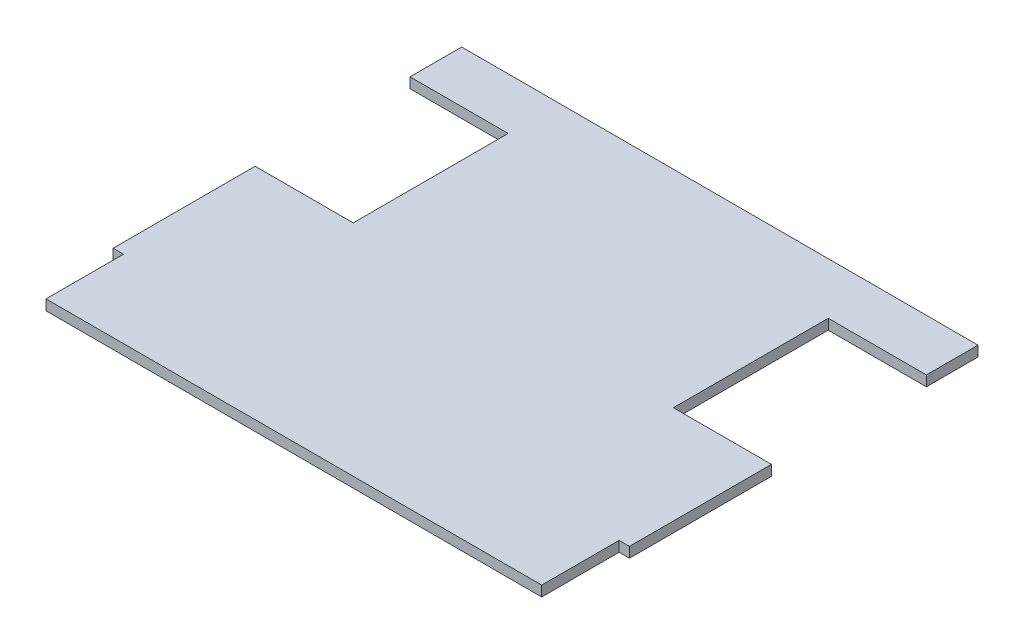
ISO-10303-21;
HEADER;
FILE_DESCRIPTION(('STEP AP214'),'2;1');
FILE_NAME('part.step','',(''),(''),'','','');
FILE_SCHEMA(('AUTOMOTIVE_DESIGN { 1 0 10303 214 1 1 1 1 }'));
ENDSEC;
DATA;
#1=APPLICATION_CONTEXT('core data for automotive mechanical design processes');
#2=APPLICATION_PROTOCOL_DEFINITION('international standard','automotive_design',2000,#1);
#3=PRODUCT_CONTEXT('',#1,'mechanical');
#4=PRODUCT('Part','Part','',(#3));
#5=PRODUCT_RELATED_PRODUCT_CATEGORY('part','',(#4));
#6=PRODUCT_DEFINITION_FORMATION('','',#4);
#7=PRODUCT_DEFINITION_CONTEXT('part definition',#1,'design');
#8=PRODUCT_DEFINITION('design','',#6,#7);
#9=PRODUCT_DEFINITION_SHAPE('','',#8);
#10=(LENGTH_UNIT() NAMED_UNIT(*) SI_UNIT(.MILLI.,.METRE.));
#11=(NAMED_UNIT(*) PLANE_ANGLE_UNIT() SI_UNIT($,.RADIAN.));
#12=(NAMED_UNIT(*) SI_UNIT($,.STERADIAN.) SOLID_ANGLE_UNIT());
#13=UNCERTAINTY_MEASURE_WITH_UNIT(LENGTH_MEASURE(1.E-05),#10,'distance_accuracy_value','');
#14=(GEOMETRIC_REPRESENTATION_CONTEXT(3) GLOBAL_UNCERTAINTY_ASSIGNED_CONTEXT((#13)) GLOBAL_UNIT_ASSIGNED_CONTEXT((#10,
#11,#12)) REPRESENTATION_CONTEXT('',''));
#15=CARTESIAN_POINT('',(0.,0.,0.));
#16=DIRECTION('',(0.,0.,1.));
#17=DIRECTION('',(1.,0.,0.));
#18=AXIS2_PLACEMENT_3D('',#15,#16,#17);
#19=CARTESIAN_POINT('',(100.,4.,0.));
#20=DIRECTION('',(1.,0.,0.));
#21=DIRECTION('',(0.,0.,-1.));
#22=AXIS2_PLACEMENT_3D('',#19,#20,#21);
#23=PLANE('',#22);
#24=DIRECTION('',(0.,1.,0.));
#25=VECTOR('',#24,1.);
#26=CARTESIAN_POINT('',(100.,-0.00100000000000013,52.5));
#27=LINE('',#26,#25);
#28=CARTESIAN_POINT('',(100.,0.,52.5));
#29=VERTEX_POINT('',#28);
#30=CARTESIAN_POINT('',(100.,4.,52.5));
#31=VERTEX_POINT('',#30);
#32=EDGE_CURVE('E157',#29,#31,#27,.T.);
#33=ORIENTED_EDGE('',*,*,#32,.F.);
#34=DIRECTION('',(0.,0.,1.));
#35=VECTOR('',#34,1.);
#36=CARTESIAN_POINT('',(100.,0.,0.));
#37=LINE('',#36,#35);
#38=CARTESIAN_POINT('',(100.,0.,-2.50000000000004));
#39=VERTEX_POINT('',#38);
#40=EDGE_CURVE('E163',#39,#29,#37,.T.);
#41=ORIENTED_EDGE('',*,*,#40,.F.);
#42=DIRECTION('',(0.,-1.,0.));
#43=VECTOR('',#42,1.);
#44=CARTESIAN_POINT('',(100.,4.,-2.50000000000004));
#45=LINE('',#44,#43);
#46=CARTESIAN_POINT('',(100.,4.,-2.50000000000004));
#47=VERTEX_POINT('',#46);
#48=EDGE_CURVE('E11',#47,#39,#45,.T.);
#49=ORIENTED_EDGE('',*,*,#48,.F.);
#50=DIRECTION('',(0.,0.,1.));
#51=VECTOR('',#50,1.);
#52=CARTESIAN_POINT('',(100.,4.,0.));
#53=LINE('',#52,#51);
#54=EDGE_CURVE('E170',#47,#31,#53,.T.);
#55=ORIENTED_EDGE('',*,*,#54,.T.);
#56=EDGE_LOOP('',(#33,#41,#49,#55));
#57=FACE_BOUND('',#56,.T.);
#58=ADVANCED_FACE('F41',(#57),#23,.T.);
#59=CARTESIAN_POINT('',(0.,4.,-2.50000000000002));
#60=DIRECTION('',(0.,0.,1.));
#61=DIRECTION('',(1.,0.,0.));
#62=AXIS2_PLACEMENT_3D('',#59,#60,#61);
#63=PLANE('',#62);
#64=DIRECTION('',(-1.,0.,0.));
#65=VECTOR('',#64,1.);
#66=CARTESIAN_POINT('',(0.,0.,-2.50000000000002));
#67=LINE('',#66,#65);
#68=CARTESIAN_POINT('',(62.,0.,-2.50000000000003));
#69=VERTEX_POINT('',#68);
#70=EDGE_CURVE('E177',#39,#69,#67,.T.);
#71=ORIENTED_EDGE('',*,*,#70,.T.);
#72=DIRECTION('',(0.,-1.,0.));
#73=VECTOR('',#72,1.);
#74=CARTESIAN_POINT('',(62.,4.,-2.50000000000003));
#75=LINE('',#74,#73);
#76=CARTESIAN_POINT('',(62.,4.,-2.50000000000003));
#77=VERTEX_POINT('',#76);
#78=EDGE_CURVE('E50',#77,#69,#75,.T.);
#79=ORIENTED_EDGE('',*,*,#78,.F.);
#80=DIRECTION('',(-1.,0.,0.));
#81=VECTOR('',#80,1.);
#82=CARTESIAN_POINT('',(0.,4.,-2.50000000000002));
#83=LINE('',#82,#81);
#84=EDGE_CURVE('E256',#47,#77,#83,.T.);
#85=ORIENTED_EDGE('',*,*,#84,.F.);
#86=ORIENTED_EDGE('',*,*,#48,.T.);
#87=EDGE_LOOP('',(#71,#79,#85,#86));
#88=FACE_BOUND('',#87,.T.);
#89=ADVANCED_FACE('F43',(#88),#63,.F.);
#90=CARTESIAN_POINT('',(62.,4.,0.));
#91=DIRECTION('',(-1.,0.,0.));
#92=DIRECTION('',(0.,0.,1.));
#93=AXIS2_PLACEMENT_3D('',#90,#91,#92);
#94=PLANE('',#93);
#95=DIRECTION('',(0.,0.,-1.));
#96=VECTOR('',#95,1.);
#97=CARTESIAN_POINT('',(62.,0.,0.));
#98=LINE('',#97,#96);
#99=CARTESIAN_POINT('',(62.,0.,-62.5));
#100=VERTEX_POINT('',#99);
#101=EDGE_CURVE('E182',#69,#100,#98,.T.);
#102=ORIENTED_EDGE('',*,*,#101,.T.);
#103=DIRECTION('',(0.,-1.,0.));
#104=VECTOR('',#103,1.);
#105=CARTESIAN_POINT('',(62.,4.,-62.5));
#106=LINE('',#105,#104);
#107=CARTESIAN_POINT('',(62.,4.,-62.5));
#108=VERTEX_POINT('',#107);
#109=EDGE_CURVE('E244',#108,#100,#106,.T.);
#110=ORIENTED_EDGE('',*,*,#109,.F.);
#111=DIRECTION('',(0.,0.,-1.));
#112=VECTOR('',#111,1.);
#113=CARTESIAN_POINT('',(62.,4.,0.));
#114=LINE('',#113,#112);
#115=EDGE_CURVE('E253',#77,#108,#114,.T.);
#116=ORIENTED_EDGE('',*,*,#115,.F.);
#117=ORIENTED_EDGE('',*,*,#78,.T.);
#118=EDGE_LOOP('',(#102,#110,#116,#117));
#119=FACE_BOUND('',#118,.T.);
#120=ADVANCED_FACE('F251',(#119),#94,.F.);
#121=CARTESIAN_POINT('',(0.,4.,-62.5));
#122=DIRECTION('',(0.,0.,1.));
#123=DIRECTION('',(1.,0.,0.));
#124=AXIS2_PLACEMENT_3D('',#121,#122,#123);
#125=PLANE('',#124);
#126=DIRECTION('',(-1.,0.,0.));
#127=VECTOR('',#126,1.);
#128=CARTESIAN_POINT('',(0.,0.,-62.5));
#129=LINE('',#128,#127);
#130=CARTESIAN_POINT('',(100.,0.,-62.5));
#131=VERTEX_POINT('',#130);
#132=EDGE_CURVE('E188',#131,#100,#129,.T.);
#133=ORIENTED_EDGE('',*,*,#132,.F.);
#134=DIRECTION('',(0.,-1.,0.));
#135=VECTOR('',#134,1.);
#136=CARTESIAN_POINT('',(100.,4.,-62.5));
#137=LINE('',#136,#135);
#138=CARTESIAN_POINT('',(100.,4.,-62.5));
#139=VERTEX_POINT('',#138);
#140=EDGE_CURVE('E241',#139,#131,#137,.T.);
#141=ORIENTED_EDGE('',*,*,#140,.F.);
#142=DIRECTION('',(-1.,0.,0.));
#143=VECTOR('',#142,1.);
#144=CARTESIAN_POINT('',(0.,4.,-62.5));
#145=LINE('',#144,#143);
#146=EDGE_CURVE('E270',#139,#108,#145,.T.);
#147=ORIENTED_EDGE('',*,*,#146,.T.);
#148=ORIENTED_EDGE('',*,*,#109,.T.);
#149=EDGE_LOOP('',(#133,#141,#147,#148));
#150=FACE_BOUND('',#149,.T.);
#151=ADVANCED_FACE('F372',(#150),#125,.T.);
#152=CARTESIAN_POINT('',(100.,0.,-82.5));
#153=VERTEX_POINT('',#152);
#154=EDGE_CURVE('E180',#153,#131,#37,.T.);
#155=ORIENTED_EDGE('',*,*,#154,.F.);
#156=DIRECTION('',(0.,-1.,0.));
#157=VECTOR('',#156,1.);
#158=CARTESIAN_POINT('',(100.,4.,-82.5));
#159=LINE('',#158,#157);
#160=CARTESIAN_POINT('',(100.,4.,-82.5));
#161=VERTEX_POINT('',#160);
#162=EDGE_CURVE('E238',#161,#153,#159,.T.);
#163=ORIENTED_EDGE('',*,*,#162,.F.);
#164=EDGE_CURVE('E265',#161,#139,#53,.T.);
#165=ORIENTED_EDGE('',*,*,#164,.T.);
#166=ORIENTED_EDGE('',*,*,#140,.T.);
#167=EDGE_LOOP('',(#155,#163,#165,#166));
#168=FACE_BOUND('',#167,.T.);
#169=ADVANCED_FACE('F364',(#168),#23,.T.);
#170=CARTESIAN_POINT('',(0.,4.,-82.5));
#171=DIRECTION('',(0.,0.,-1.));
#172=DIRECTION('',(-1.,0.,0.));
#173=AXIS2_PLACEMENT_3D('',#170,#171,#172);
#174=PLANE('',#173);
#175=DIRECTION('',(1.,0.,0.));
#176=VECTOR('',#175,1.);
#177=CARTESIAN_POINT('',(0.,0.,-82.5));
#178=LINE('',#177,#176);
#179=CARTESIAN_POINT('',(-100.,0.,-82.5));
#180=VERTEX_POINT('',#179);
#181=EDGE_CURVE('E187',#180,#153,#178,.T.);
#182=ORIENTED_EDGE('',*,*,#181,.F.);
#183=DIRECTION('',(0.,-1.,0.));
#184=VECTOR('',#183,1.);
#185=CARTESIAN_POINT('',(-100.,4.,-82.5));
#186=LINE('',#185,#184);
#187=CARTESIAN_POINT('',(-100.,4.,-82.5));
#188=VERTEX_POINT('',#187);
#189=EDGE_CURVE('E235',#188,#180,#186,.T.);
#190=ORIENTED_EDGE('',*,*,#189,.F.);
#191=DIRECTION('',(1.,0.,0.));
#192=VECTOR('',#191,1.);
#193=CARTESIAN_POINT('',(0.,4.,-82.5));
#194=LINE('',#193,#192);
#195=EDGE_CURVE('E269',#188,#161,#194,.T.);
#196=ORIENTED_EDGE('',*,*,#195,.T.);
#197=ORIENTED_EDGE('',*,*,#162,.T.);
#198=EDGE_LOOP('',(#182,#190,#196,#197));
#199=FACE_BOUND('',#198,.T.);
#200=ADVANCED_FACE('F371',(#199),#174,.T.);
#201=CARTESIAN_POINT('',(-100.,4.,0.));
#202=DIRECTION('',(1.,0.,0.));
#203=DIRECTION('',(0.,0.,-1.));
#204=AXIS2_PLACEMENT_3D('',#201,#202,#203);
#205=PLANE('',#204);
#206=DIRECTION('',(0.,0.,1.));
#207=VECTOR('',#206,1.);
#208=CARTESIAN_POINT('',(-100.,0.,0.));
#209=LINE('',#208,#207);
#210=CARTESIAN_POINT('',(-100.,0.,-62.5));
#211=VERTEX_POINT('',#210);
#212=EDGE_CURVE('E194',#180,#211,#209,.T.);
#213=ORIENTED_EDGE('',*,*,#212,.T.);
#214=DIRECTION('',(0.,-1.,0.));
#215=VECTOR('',#214,1.);
#216=CARTESIAN_POINT('',(-100.,4.,-62.5));
#217=LINE('',#216,#215);
#218=CARTESIAN_POINT('',(-100.,4.,-62.5));
#219=VERTEX_POINT('',#218);
#220=EDGE_CURVE('E231',#219,#211,#217,.T.);
#221=ORIENTED_EDGE('',*,*,#220,.F.);
#222=DIRECTION('',(0.,0.,1.));
#223=VECTOR('',#222,1.);
#224=CARTESIAN_POINT('',(-100.,4.,0.));
#225=LINE('',#224,#223);
#226=EDGE_CURVE('E276',#188,#219,#225,.T.);
#227=ORIENTED_EDGE('',*,*,#226,.F.);
#228=ORIENTED_EDGE('',*,*,#189,.T.);
#229=EDGE_LOOP('',(#213,#221,#227,#228));
#230=FACE_BOUND('',#229,.T.);
#231=ADVANCED_FACE('F377',(#230),#205,.F.);
#232=CARTESIAN_POINT('',(0.,4.,-62.5));
#233=DIRECTION('',(0.,0.,-1.));
#234=DIRECTION('',(-1.,0.,0.));
#235=AXIS2_PLACEMENT_3D('',#232,#233,#234);
#236=PLANE('',#235);
#237=DIRECTION('',(1.,0.,0.));
#238=VECTOR('',#237,1.);
#239=CARTESIAN_POINT('',(0.,0.,-62.5));
#240=LINE('',#239,#238);
#241=CARTESIAN_POINT('',(-62.,0.,-62.5));
#242=VERTEX_POINT('',#241);
#243=EDGE_CURVE('E204',#211,#242,#240,.T.);
#244=ORIENTED_EDGE('',*,*,#243,.T.);
#245=DIRECTION('',(0.,-1.,0.));
#246=VECTOR('',#245,1.);
#247=CARTESIAN_POINT('',(-62.,4.,-62.5));
#248=LINE('',#247,#246);
#249=CARTESIAN_POINT('',(-62.,4.,-62.5));
#250=VERTEX_POINT('',#249);
#251=EDGE_CURVE('E228',#250,#242,#248,.T.);
#252=ORIENTED_EDGE('',*,*,#251,.F.);
#253=DIRECTION('',(1.,0.,0.));
#254=VECTOR('',#253,1.);
#255=CARTESIAN_POINT('',(0.,4.,-62.5));
#256=LINE('',#255,#254);
#257=EDGE_CURVE('E287',#219,#250,#256,.T.);
#258=ORIENTED_EDGE('',*,*,#257,.F.);
#259=ORIENTED_EDGE('',*,*,#220,.T.);
#260=EDGE_LOOP('',(#244,#252,#258,#259));
#261=FACE_BOUND('',#260,.T.);
#262=ADVANCED_FACE('F389',(#261),#236,.F.);
#263=CARTESIAN_POINT('',(-62.,4.,0.));
#264=DIRECTION('',(-1.,0.,0.));
#265=DIRECTION('',(0.,0.,1.));
#266=AXIS2_PLACEMENT_3D('',#263,#264,#265);
#267=PLANE('',#266);
#268=DIRECTION('',(0.,0.,-1.));
#269=VECTOR('',#268,1.);
#270=CARTESIAN_POINT('',(-62.,0.,0.));
#271=LINE('',#270,#269);
#272=CARTESIAN_POINT('',(-62.,0.,-2.50000000000002));
#273=VERTEX_POINT('',#272);
#274=EDGE_CURVE('E209',#273,#242,#271,.T.);
#275=ORIENTED_EDGE('',*,*,#274,.F.);
#276=DIRECTION('',(0.,-1.,0.));
#277=VECTOR('',#276,1.);
#278=CARTESIAN_POINT('',(-62.,4.,-2.50000000000002));
#279=LINE('',#278,#277);
#280=CARTESIAN_POINT('',(-62.,4.,-2.50000000000002));
#281=VERTEX_POINT('',#280);
#282=EDGE_CURVE('E224',#281,#273,#279,.T.);
#283=ORIENTED_EDGE('',*,*,#282,.F.);
#284=DIRECTION('',(0.,0.,-1.));
#285=VECTOR('',#284,1.);
#286=CARTESIAN_POINT('',(-62.,4.,0.));
#287=LINE('',#286,#285);
#288=EDGE_CURVE('E291',#281,#250,#287,.T.);
#289=ORIENTED_EDGE('',*,*,#288,.T.);
#290=ORIENTED_EDGE('',*,*,#251,.T.);
#291=EDGE_LOOP('',(#275,#283,#289,#290));
#292=FACE_BOUND('',#291,.T.);
#293=ADVANCED_FACE('F392',(#292),#267,.T.);
#294=CARTESIAN_POINT('',(0.,4.,-2.50000000000002));
#295=DIRECTION('',(0.,0.,-1.));
#296=DIRECTION('',(-1.,0.,0.));
#297=AXIS2_PLACEMENT_3D('',#294,#295,#296);
#298=PLANE('',#297);
#299=DIRECTION('',(1.,0.,0.));
#300=VECTOR('',#299,1.);
#301=CARTESIAN_POINT('',(0.,0.,-2.50000000000002));
#302=LINE('',#301,#300);
#303=CARTESIAN_POINT('',(-100.,0.,-2.50000000000002));
#304=VERTEX_POINT('',#303);
#305=EDGE_CURVE('E213',#304,#273,#302,.T.);
#306=ORIENTED_EDGE('',*,*,#305,.F.);
#307=DIRECTION('',(0.,-1.,0.));
#308=VECTOR('',#307,1.);
#309=CARTESIAN_POINT('',(-100.,4.,-2.50000000000002));
#310=LINE('',#309,#308);
#311=CARTESIAN_POINT('',(-100.,4.,-2.50000000000002));
#312=VERTEX_POINT('',#311);
#313=EDGE_CURVE('E221',#312,#304,#310,.T.);
#314=ORIENTED_EDGE('',*,*,#313,.F.);
#315=DIRECTION('',(1.,0.,0.));
#316=VECTOR('',#315,1.);
#317=CARTESIAN_POINT('',(0.,4.,-2.50000000000002));
#318=LINE('',#317,#316);
#319=EDGE_CURVE('E295',#312,#281,#318,.T.);
#320=ORIENTED_EDGE('',*,*,#319,.T.);
#321=ORIENTED_EDGE('',*,*,#282,.T.);
#322=EDGE_LOOP('',(#306,#314,#320,#321));
#323=FACE_BOUND('',#322,.T.);
#324=ADVANCED_FACE('F395',(#323),#298,.T.);
#325=CARTESIAN_POINT('',(-100.,0.,52.5));
#326=VERTEX_POINT('',#325);
#327=EDGE_CURVE('E205',#304,#326,#209,.T.);
#328=ORIENTED_EDGE('',*,*,#327,.T.);
#329=DIRECTION('',(0.,1.,0.));
#330=VECTOR('',#329,1.);
#331=CARTESIAN_POINT('',(-100.,-0.00100000000000013,52.5));
#332=LINE('',#331,#330);
#333=CARTESIAN_POINT('',(-100.,4.,52.5));
#334=VERTEX_POINT('',#333);
#335=EDGE_CURVE('E314',#326,#334,#332,.T.);
#336=ORIENTED_EDGE('',*,*,#335,.T.);
#337=EDGE_CURVE('E288',#312,#334,#225,.T.);
#338=ORIENTED_EDGE('',*,*,#337,.F.);
#339=ORIENTED_EDGE('',*,*,#313,.T.);
#340=EDGE_LOOP('',(#328,#336,#338,#339));
#341=FACE_BOUND('',#340,.T.);
#342=ADVANCED_FACE('F312',(#341),#205,.F.);
#343=CARTESIAN_POINT('',(0.,4.,82.5));
#344=DIRECTION('',(0.,0.,-1.));
#345=DIRECTION('',(-1.,0.,0.));
#346=AXIS2_PLACEMENT_3D('',#343,#344,#345);
#347=PLANE('',#346);
#348=DIRECTION('',(1.,0.,0.));
#349=VECTOR('',#348,1.);
#350=CARTESIAN_POINT('',(0.,0.,82.5));
#351=LINE('',#350,#349);
#352=CARTESIAN_POINT('',(-96.,0.,82.5));
#353=VERTEX_POINT('',#352);
#354=CARTESIAN_POINT('',(96.,0.,82.5));
#355=VERTEX_POINT('',#354);
#356=EDGE_CURVE('E217',#353,#355,#351,.T.);
#357=ORIENTED_EDGE('',*,*,#356,.T.);
#358=DIRECTION('',(0.,1.,0.));
#359=VECTOR('',#358,1.);
#360=CARTESIAN_POINT('',(96.,-0.00100000000000013,82.5));
#361=LINE('',#360,#359);
#362=CARTESIAN_POINT('',(96.,4.,82.5));
#363=VERTEX_POINT('',#362);
#364=EDGE_CURVE('E164',#355,#363,#361,.T.);
#365=ORIENTED_EDGE('',*,*,#364,.T.);
#366=DIRECTION('',(1.,0.,0.));
#367=VECTOR('',#366,1.);
#368=CARTESIAN_POINT('',(0.,4.,82.5));
#369=LINE('',#368,#367);
#370=CARTESIAN_POINT('',(-96.,4.,82.5));
#371=VERTEX_POINT('',#370);
#372=EDGE_CURVE('E225',#371,#363,#369,.T.);
#373=ORIENTED_EDGE('',*,*,#372,.F.);
#374=DIRECTION('',(0.,1.,0.));
#375=VECTOR('',#374,1.);
#376=CARTESIAN_POINT('',(-96.,-0.00100000000000013,82.5));
#377=LINE('',#376,#375);
#378=EDGE_CURVE('E321',#353,#371,#377,.T.);
#379=ORIENTED_EDGE('',*,*,#378,.F.);
#380=EDGE_LOOP('',(#357,#365,#373,#379));
#381=FACE_BOUND('',#380,.T.);
#382=ADVANCED_FACE('F348',(#381),#347,.F.);
#383=CARTESIAN_POINT('',(0.,4.,0.));
#384=DIRECTION('',(0.,1.,0.));
#385=DIRECTION('',(0.,0.,1.));
#386=AXIS2_PLACEMENT_3D('',#383,#384,#385);
#387=PLANE('',#386);
#388=DIRECTION('',(0.,0.,1.));
#389=VECTOR('',#388,1.);
#390=CARTESIAN_POINT('',(96.,4.,52.5));
#391=LINE('',#390,#389);
#392=CARTESIAN_POINT('',(96.,4.,52.5));
#393=VERTEX_POINT('',#392);
#394=EDGE_CURVE('E172',#393,#363,#391,.T.);
#395=ORIENTED_EDGE('',*,*,#394,.F.);
#396=DIRECTION('',(-1.,0.,0.));
#397=VECTOR('',#396,1.);
#398=CARTESIAN_POINT('',(100.,4.,52.5));
#399=LINE('',#398,#397);
#400=EDGE_CURVE('E262',#31,#393,#399,.T.);
#401=ORIENTED_EDGE('',*,*,#400,.F.);
#402=ORIENTED_EDGE('',*,*,#54,.F.);
#403=ORIENTED_EDGE('',*,*,#84,.T.);
#404=ORIENTED_EDGE('',*,*,#115,.T.);
#405=ORIENTED_EDGE('',*,*,#146,.F.);
#406=ORIENTED_EDGE('',*,*,#164,.F.);
#407=ORIENTED_EDGE('',*,*,#195,.F.);
#408=ORIENTED_EDGE('',*,*,#226,.T.);
#409=ORIENTED_EDGE('',*,*,#257,.T.);
#410=ORIENTED_EDGE('',*,*,#288,.F.);
#411=ORIENTED_EDGE('',*,*,#319,.F.);
#412=ORIENTED_EDGE('',*,*,#337,.T.);
#413=DIRECTION('',(-1.,0.,0.));
#414=VECTOR('',#413,1.);
#415=CARTESIAN_POINT('',(-100.,4.,52.5));
#416=LINE('',#415,#414);
#417=CARTESIAN_POINT('',(-96.,4.,52.5));
#418=VERTEX_POINT('',#417);
#419=EDGE_CURVE('E307',#418,#334,#416,.T.);
#420=ORIENTED_EDGE('',*,*,#419,.F.);
#421=DIRECTION('',(0.,0.,-1.));
#422=VECTOR('',#421,1.);
#423=CARTESIAN_POINT('',(-96.,4.,52.5));
#424=LINE('',#423,#422);
#425=EDGE_CURVE('E330',#371,#418,#424,.T.);
#426=ORIENTED_EDGE('',*,*,#425,.F.);
#427=ORIENTED_EDGE('',*,*,#372,.T.);
#428=EDGE_LOOP('',(#395,#401,#402,#403,#404,#405,#406,#407,#408,#409,#410,#411,#412,#420,#426,#427));
#429=FACE_BOUND('',#428,.T.);
#430=ADVANCED_FACE('F261',(#429),#387,.T.);
#431=CARTESIAN_POINT('',(0.,0.,0.));
#432=DIRECTION('',(0.,1.,0.));
#433=DIRECTION('',(0.,0.,1.));
#434=AXIS2_PLACEMENT_3D('',#431,#432,#433);
#435=PLANE('',#434);
#436=DIRECTION('',(1.,0.,0.));
#437=VECTOR('',#436,1.);
#438=CARTESIAN_POINT('',(100.,0.,52.5));
#439=LINE('',#438,#437);
#440=CARTESIAN_POINT('',(96.,0.,52.5));
#441=VERTEX_POINT('',#440);
#442=EDGE_CURVE('E153',#441,#29,#439,.T.);
#443=ORIENTED_EDGE('',*,*,#442,.F.);
#444=DIRECTION('',(0.,0.,-1.));
#445=VECTOR('',#444,1.);
#446=CARTESIAN_POINT('',(96.,0.,52.5));
#447=LINE('',#446,#445);
#448=EDGE_CURVE('E57',#355,#441,#447,.T.);
#449=ORIENTED_EDGE('',*,*,#448,.F.);
#450=ORIENTED_EDGE('',*,*,#356,.F.);
#451=DIRECTION('',(0.,0.,1.));
#452=VECTOR('',#451,1.);
#453=CARTESIAN_POINT('',(-96.,0.,52.5));
#454=LINE('',#453,#452);
#455=CARTESIAN_POINT('',(-96.,0.,52.5));
#456=VERTEX_POINT('',#455);
#457=EDGE_CURVE('E333',#456,#353,#454,.T.);
#458=ORIENTED_EDGE('',*,*,#457,.F.);
#459=DIRECTION('',(1.,0.,0.));
#460=VECTOR('',#459,1.);
#461=CARTESIAN_POINT('',(-100.,0.,52.5));
#462=LINE('',#461,#460);
#463=EDGE_CURVE('E65',#326,#456,#462,.T.);
#464=ORIENTED_EDGE('',*,*,#463,.F.);
#465=ORIENTED_EDGE('',*,*,#327,.F.);
#466=ORIENTED_EDGE('',*,*,#305,.T.);
#467=ORIENTED_EDGE('',*,*,#274,.T.);
#468=ORIENTED_EDGE('',*,*,#243,.F.);
#469=ORIENTED_EDGE('',*,*,#212,.F.);
#470=ORIENTED_EDGE('',*,*,#181,.T.);
#471=ORIENTED_EDGE('',*,*,#154,.T.);
#472=ORIENTED_EDGE('',*,*,#132,.T.);
#473=ORIENTED_EDGE('',*,*,#101,.F.);
#474=ORIENTED_EDGE('',*,*,#70,.F.);
#475=ORIENTED_EDGE('',*,*,#40,.T.);
#476=EDGE_LOOP('',(#443,#449,#450,#458,#464,#465,#466,#467,#468,#469,#470,#471,#472,#473,#474,#475));
#477=FACE_BOUND('',#476,.T.);
#478=ADVANCED_FACE('F175',(#477),#435,.F.);
#479=CARTESIAN_POINT('',(-100.,-0.00100000000000013,52.5));
#480=DIRECTION('',(0.,0.,-1.));
#481=DIRECTION('',(-1.,0.,0.));
#482=AXIS2_PLACEMENT_3D('',#479,#480,#481);
#483=PLANE('',#482);
#484=ORIENTED_EDGE('',*,*,#463,.T.);
#485=DIRECTION('',(0.,1.,0.));
#486=VECTOR('',#485,1.);
#487=CARTESIAN_POINT('',(-96.,-0.00100000000000013,52.5));
#488=LINE('',#487,#486);
#489=EDGE_CURVE('E316',#456,#418,#488,.T.);
#490=ORIENTED_EDGE('',*,*,#489,.T.);
#491=ORIENTED_EDGE('',*,*,#419,.T.);
#492=ORIENTED_EDGE('',*,*,#335,.F.);
#493=EDGE_LOOP('',(#484,#490,#491,#492));
#494=FACE_BOUND('',#493,.T.);
#495=ADVANCED_FACE('F352',(#494),#483,.F.);
#496=CARTESIAN_POINT('',(-96.,-0.00100000000000013,52.5));
#497=DIRECTION('',(1.,0.,0.));
#498=DIRECTION('',(0.,0.,-1.));
#499=AXIS2_PLACEMENT_3D('',#496,#497,#498);
#500=PLANE('',#499);
#501=ORIENTED_EDGE('',*,*,#457,.T.);
#502=ORIENTED_EDGE('',*,*,#378,.T.);
#503=ORIENTED_EDGE('',*,*,#425,.T.);
#504=ORIENTED_EDGE('',*,*,#489,.F.);
#505=EDGE_LOOP('',(#501,#502,#503,#504));
#506=FACE_BOUND('',#505,.T.);
#507=ADVANCED_FACE('F351',(#506),#500,.F.);
#508=CARTESIAN_POINT('',(96.,-0.00100000000000013,52.5));
#509=DIRECTION('',(-1.,0.,0.));
#510=DIRECTION('',(0.,0.,1.));
#511=AXIS2_PLACEMENT_3D('',#508,#509,#510);
#512=PLANE('',#511);
#513=ORIENTED_EDGE('',*,*,#448,.T.);
#514=DIRECTION('',(0.,1.,0.));
#515=VECTOR('',#514,1.);
#516=CARTESIAN_POINT('',(96.,-0.00100000000000013,52.5));
#517=LINE('',#516,#515);
#518=EDGE_CURVE('E159',#441,#393,#517,.T.);
#519=ORIENTED_EDGE('',*,*,#518,.T.);
#520=ORIENTED_EDGE('',*,*,#394,.T.);
#521=ORIENTED_EDGE('',*,*,#364,.F.);
#522=EDGE_LOOP('',(#513,#519,#520,#521));
#523=FACE_BOUND('',#522,.T.);
#524=ADVANCED_FACE('F346',(#523),#512,.F.);
#525=CARTESIAN_POINT('',(100.,-0.00100000000000013,52.5));
#526=DIRECTION('',(0.,0.,-1.));
#527=DIRECTION('',(-1.,0.,0.));
#528=AXIS2_PLACEMENT_3D('',#525,#526,#527);
#529=PLANE('',#528);
#530=ORIENTED_EDGE('',*,*,#442,.T.);
#531=ORIENTED_EDGE('',*,*,#32,.T.);
#532=ORIENTED_EDGE('',*,*,#400,.T.);
#533=ORIENTED_EDGE('',*,*,#518,.F.);
#534=EDGE_LOOP('',(#530,#531,#532,#533));
#535=FACE_BOUND('',#534,.T.);
#536=ADVANCED_FACE('F155',(#535),#529,.F.);
#537=CLOSED_SHELL('',(#58,#89,#120,#151,#169,#200,#231,#262,#293,#324,#342,#382,#430,#478,#495,
#507,#524,#536));
#538=MANIFOLD_SOLID_BREP('B2',#537);
#539=ADVANCED_BREP_SHAPE_REPRESENTATION('',(#18,#538),#14);
#540=SHAPE_DEFINITION_REPRESENTATION(#9,#539);
ENDSEC;
END-ISO-10303-21;
